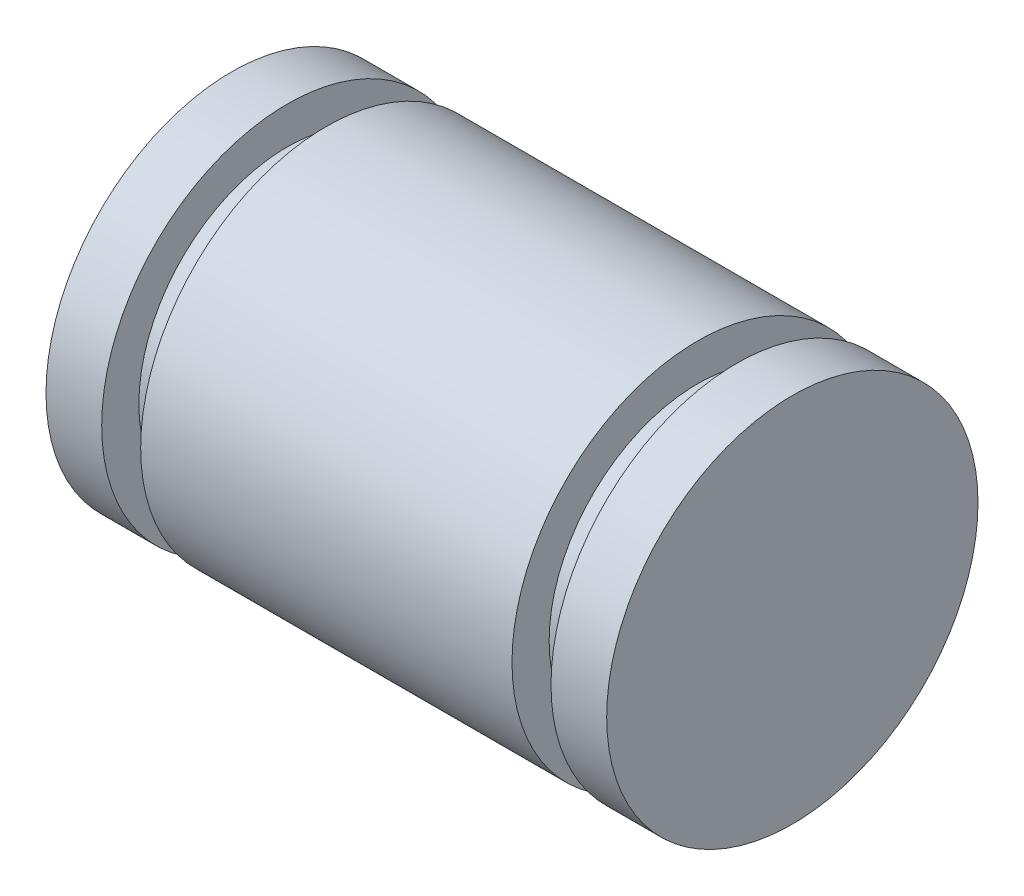
ISO-10303-21;
HEADER;
FILE_DESCRIPTION(('STEP AP214'),'2;1');
FILE_NAME('part.step','',(''),(''),'','','');
FILE_SCHEMA(('AUTOMOTIVE_DESIGN { 1 0 10303 214 1 1 1 1 }'));
ENDSEC;
DATA;
#1=APPLICATION_CONTEXT('core data for automotive mechanical design processes');
#2=APPLICATION_PROTOCOL_DEFINITION('international standard','automotive_design',2000,#1);
#3=PRODUCT_CONTEXT('',#1,'mechanical');
#4=PRODUCT('Part','Part','',(#3));
#5=PRODUCT_RELATED_PRODUCT_CATEGORY('part','',(#4));
#6=PRODUCT_DEFINITION_FORMATION('','',#4);
#7=PRODUCT_DEFINITION_CONTEXT('part definition',#1,'design');
#8=PRODUCT_DEFINITION('design','',#6,#7);
#9=PRODUCT_DEFINITION_SHAPE('','',#8);
#10=(LENGTH_UNIT() NAMED_UNIT(*) SI_UNIT(.MILLI.,.METRE.));
#11=(NAMED_UNIT(*) PLANE_ANGLE_UNIT() SI_UNIT($,.RADIAN.));
#12=(NAMED_UNIT(*) SI_UNIT($,.STERADIAN.) SOLID_ANGLE_UNIT());
#13=UNCERTAINTY_MEASURE_WITH_UNIT(LENGTH_MEASURE(1.E-05),#10,'distance_accuracy_value','');
#14=(GEOMETRIC_REPRESENTATION_CONTEXT(3) GLOBAL_UNCERTAINTY_ASSIGNED_CONTEXT((#13)) GLOBAL_UNIT_ASSIGNED_CONTEXT((#10,
#11,#12)) REPRESENTATION_CONTEXT('',''));
#15=CARTESIAN_POINT('',(0.,0.,0.));
#16=DIRECTION('',(0.,0.,1.));
#17=DIRECTION('',(1.,0.,0.));
#18=AXIS2_PLACEMENT_3D('',#15,#16,#17);
#19=CARTESIAN_POINT('',(15.1,0.,0.));
#20=DIRECTION('',(1.,0.,0.));
#21=DIRECTION('',(0.,0.,-1.));
#22=AXIS2_PLACEMENT_3D('',#19,#20,#21);
#23=PLANE('',#22);
#24=CARTESIAN_POINT('',(15.1,0.,0.));
#25=DIRECTION('',(-1.,0.,0.));
#26=DIRECTION('',(0.,0.,1.));
#27=AXIS2_PLACEMENT_3D('',#24,#25,#26);
#28=CIRCLE('',#27,5.);
#29=CARTESIAN_POINT('',(15.1,0.,5.));
#30=VERTEX_POINT('',#29);
#31=EDGE_CURVE('E10',#30,#30,#28,.T.);
#32=ORIENTED_EDGE('',*,*,#31,.F.);
#33=EDGE_LOOP('',(#32));
#34=FACE_BOUND('',#33,.T.);
#35=ADVANCED_FACE('F37',(#34),#23,.T.);
#36=CARTESIAN_POINT('',(0.,0.,0.));
#37=DIRECTION('',(-1.,0.,0.));
#38=DIRECTION('',(0.,0.,1.));
#39=AXIS2_PLACEMENT_3D('',#36,#37,#38);
#40=CYLINDRICAL_SURFACE('',#39,5.);
#41=ORIENTED_EDGE('',*,*,#31,.T.);
#42=EDGE_LOOP('',(#41));
#43=FACE_BOUND('',#42,.T.);
#44=CARTESIAN_POINT('',(13.6,0.,0.));
#45=DIRECTION('',(-1.,0.,0.));
#46=DIRECTION('',(0.,0.,1.));
#47=AXIS2_PLACEMENT_3D('',#44,#45,#46);
#48=CIRCLE('',#47,5.);
#49=CARTESIAN_POINT('',(13.6,0.,5.));
#50=VERTEX_POINT('',#49);
#51=EDGE_CURVE('E44',#50,#50,#48,.T.);
#52=ORIENTED_EDGE('',*,*,#51,.F.);
#53=EDGE_LOOP('',(#52));
#54=FACE_BOUND('',#53,.T.);
#55=ADVANCED_FACE('F101',(#43,#54),#40,.T.);
#56=CARTESIAN_POINT('',(13.6,-4.,0.));
#57=DIRECTION('',(-1.,0.,0.));
#58=DIRECTION('',(0.,0.,1.));
#59=AXIS2_PLACEMENT_3D('',#56,#57,#58);
#60=PLANE('',#59);
#61=ORIENTED_EDGE('',*,*,#51,.T.);
#62=EDGE_LOOP('',(#61));
#63=FACE_BOUND('',#62,.T.);
#64=CARTESIAN_POINT('',(13.6,0.,0.));
#65=DIRECTION('',(-1.,0.,0.));
#66=DIRECTION('',(0.,0.,1.));
#67=AXIS2_PLACEMENT_3D('',#64,#65,#66);
#68=CIRCLE('',#67,4.);
#69=CARTESIAN_POINT('',(13.6,0.,4.));
#70=VERTEX_POINT('',#69);
#71=EDGE_CURVE('E49',#70,#70,#68,.T.);
#72=ORIENTED_EDGE('',*,*,#71,.F.);
#73=EDGE_LOOP('',(#72));
#74=FACE_BOUND('',#73,.T.);
#75=ADVANCED_FACE('F106',(#63,#74),#60,.T.);
#76=CARTESIAN_POINT('',(0.,0.,0.));
#77=DIRECTION('',(-1.,0.,0.));
#78=DIRECTION('',(0.,0.,1.));
#79=AXIS2_PLACEMENT_3D('',#76,#77,#78);
#80=CYLINDRICAL_SURFACE('',#79,4.);
#81=ORIENTED_EDGE('',*,*,#71,.T.);
#82=EDGE_LOOP('',(#81));
#83=FACE_BOUND('',#82,.T.);
#84=CARTESIAN_POINT('',(12.55,0.,0.));
#85=DIRECTION('',(-1.,0.,0.));
#86=DIRECTION('',(0.,0.,1.));
#87=AXIS2_PLACEMENT_3D('',#84,#85,#86);
#88=CIRCLE('',#87,4.);
#89=CARTESIAN_POINT('',(12.55,0.,4.));
#90=VERTEX_POINT('',#89);
#91=EDGE_CURVE('E54',#90,#90,#88,.T.);
#92=ORIENTED_EDGE('',*,*,#91,.F.);
#93=EDGE_LOOP('',(#92));
#94=FACE_BOUND('',#93,.T.);
#95=ADVANCED_FACE('F110',(#83,#94),#80,.T.);
#96=CARTESIAN_POINT('',(12.55,-4.,0.));
#97=DIRECTION('',(1.,0.,0.));
#98=DIRECTION('',(0.,0.,-1.));
#99=AXIS2_PLACEMENT_3D('',#96,#97,#98);
#100=PLANE('',#99);
#101=ORIENTED_EDGE('',*,*,#91,.T.);
#102=EDGE_LOOP('',(#101));
#103=FACE_BOUND('',#102,.T.);
#104=CARTESIAN_POINT('',(12.55,0.,0.));
#105=DIRECTION('',(-1.,0.,0.));
#106=DIRECTION('',(0.,0.,1.));
#107=AXIS2_PLACEMENT_3D('',#104,#105,#106);
#108=CIRCLE('',#107,5.);
#109=CARTESIAN_POINT('',(12.55,0.,5.));
#110=VERTEX_POINT('',#109);
#111=EDGE_CURVE('E60',#110,#110,#108,.T.);
#112=ORIENTED_EDGE('',*,*,#111,.F.);
#113=EDGE_LOOP('',(#112));
#114=FACE_BOUND('',#113,.T.);
#115=ADVANCED_FACE('F116',(#103,#114),#100,.T.);
#116=CARTESIAN_POINT('',(0.,0.,0.));
#117=DIRECTION('',(-1.,0.,0.));
#118=DIRECTION('',(0.,0.,1.));
#119=AXIS2_PLACEMENT_3D('',#116,#117,#118);
#120=CYLINDRICAL_SURFACE('',#119,5.);
#121=ORIENTED_EDGE('',*,*,#111,.T.);
#122=EDGE_LOOP('',(#121));
#123=FACE_BOUND('',#122,.T.);
#124=CARTESIAN_POINT('',(2.55,0.,0.));
#125=DIRECTION('',(-1.,0.,0.));
#126=DIRECTION('',(0.,0.,1.));
#127=AXIS2_PLACEMENT_3D('',#124,#125,#126);
#128=CIRCLE('',#127,5.);
#129=CARTESIAN_POINT('',(2.55,0.,5.));
#130=VERTEX_POINT('',#129);
#131=EDGE_CURVE('E64',#130,#130,#128,.T.);
#132=ORIENTED_EDGE('',*,*,#131,.F.);
#133=EDGE_LOOP('',(#132));
#134=FACE_BOUND('',#133,.T.);
#135=ADVANCED_FACE('F120',(#123,#134),#120,.T.);
#136=CARTESIAN_POINT('',(2.55,-4.,0.));
#137=DIRECTION('',(-1.,0.,0.));
#138=DIRECTION('',(0.,0.,1.));
#139=AXIS2_PLACEMENT_3D('',#136,#137,#138);
#140=PLANE('',#139);
#141=ORIENTED_EDGE('',*,*,#131,.T.);
#142=EDGE_LOOP('',(#141));
#143=FACE_BOUND('',#142,.T.);
#144=CARTESIAN_POINT('',(2.55,0.,0.));
#145=DIRECTION('',(-1.,0.,0.));
#146=DIRECTION('',(0.,0.,1.));
#147=AXIS2_PLACEMENT_3D('',#144,#145,#146);
#148=CIRCLE('',#147,4.);
#149=CARTESIAN_POINT('',(2.55,0.,4.));
#150=VERTEX_POINT('',#149);
#151=EDGE_CURVE('E68',#150,#150,#148,.T.);
#152=ORIENTED_EDGE('',*,*,#151,.F.);
#153=EDGE_LOOP('',(#152));
#154=FACE_BOUND('',#153,.T.);
#155=ADVANCED_FACE('F124',(#143,#154),#140,.T.);
#156=CARTESIAN_POINT('',(0.,0.,0.));
#157=DIRECTION('',(-1.,0.,0.));
#158=DIRECTION('',(0.,0.,1.));
#159=AXIS2_PLACEMENT_3D('',#156,#157,#158);
#160=CYLINDRICAL_SURFACE('',#159,4.);
#161=ORIENTED_EDGE('',*,*,#151,.T.);
#162=EDGE_LOOP('',(#161));
#163=FACE_BOUND('',#162,.T.);
#164=CARTESIAN_POINT('',(1.5,0.,0.));
#165=DIRECTION('',(-1.,0.,0.));
#166=DIRECTION('',(0.,0.,1.));
#167=AXIS2_PLACEMENT_3D('',#164,#165,#166);
#168=CIRCLE('',#167,4.);
#169=CARTESIAN_POINT('',(1.5,0.,4.));
#170=VERTEX_POINT('',#169);
#171=EDGE_CURVE('E72',#170,#170,#168,.T.);
#172=ORIENTED_EDGE('',*,*,#171,.F.);
#173=EDGE_LOOP('',(#172));
#174=FACE_BOUND('',#173,.T.);
#175=ADVANCED_FACE('F97',(#163,#174),#160,.T.);
#176=CARTESIAN_POINT('',(1.5,-4.,0.));
#177=DIRECTION('',(1.,0.,0.));
#178=DIRECTION('',(0.,0.,-1.));
#179=AXIS2_PLACEMENT_3D('',#176,#177,#178);
#180=PLANE('',#179);
#181=ORIENTED_EDGE('',*,*,#171,.T.);
#182=EDGE_LOOP('',(#181));
#183=FACE_BOUND('',#182,.T.);
#184=CARTESIAN_POINT('',(1.5,0.,0.));
#185=DIRECTION('',(-1.,0.,0.));
#186=DIRECTION('',(0.,0.,1.));
#187=AXIS2_PLACEMENT_3D('',#184,#185,#186);
#188=CIRCLE('',#187,5.);
#189=CARTESIAN_POINT('',(1.5,0.,5.));
#190=VERTEX_POINT('',#189);
#191=EDGE_CURVE('E76',#190,#190,#188,.T.);
#192=ORIENTED_EDGE('',*,*,#191,.F.);
#193=EDGE_LOOP('',(#192));
#194=FACE_BOUND('',#193,.T.);
#195=ADVANCED_FACE('F89',(#183,#194),#180,.T.);
#196=CARTESIAN_POINT('',(0.,0.,0.));
#197=DIRECTION('',(-1.,0.,0.));
#198=DIRECTION('',(0.,0.,1.));
#199=AXIS2_PLACEMENT_3D('',#196,#197,#198);
#200=CYLINDRICAL_SURFACE('',#199,5.);
#201=ORIENTED_EDGE('',*,*,#191,.T.);
#202=EDGE_LOOP('',(#201));
#203=FACE_BOUND('',#202,.T.);
#204=CARTESIAN_POINT('',(0.,0.,0.));
#205=DIRECTION('',(-1.,0.,0.));
#206=DIRECTION('',(0.,0.,1.));
#207=AXIS2_PLACEMENT_3D('',#204,#205,#206);
#208=CIRCLE('',#207,5.);
#209=CARTESIAN_POINT('',(0.,0.,5.));
#210=VERTEX_POINT('',#209);
#211=EDGE_CURVE('E80',#210,#210,#208,.T.);
#212=ORIENTED_EDGE('',*,*,#211,.F.);
#213=EDGE_LOOP('',(#212));
#214=FACE_BOUND('',#213,.T.);
#215=ADVANCED_FACE('F87',(#203,#214),#200,.T.);
#216=CARTESIAN_POINT('',(0.,0.,0.));
#217=DIRECTION('',(-1.,0.,0.));
#218=DIRECTION('',(0.,0.,1.));
#219=AXIS2_PLACEMENT_3D('',#216,#217,#218);
#220=PLANE('',#219);
#221=ORIENTED_EDGE('',*,*,#211,.T.);
#222=EDGE_LOOP('',(#221));
#223=FACE_BOUND('',#222,.T.);
#224=ADVANCED_FACE('F85',(#223),#220,.T.);
#225=CLOSED_SHELL('',(#35,#55,#75,#95,#115,#135,#155,#175,#195,#215,#224));
#226=MANIFOLD_SOLID_BREP('B2',#225);
#227=ADVANCED_BREP_SHAPE_REPRESENTATION('',(#18,#226),#14);
#228=SHAPE_DEFINITION_REPRESENTATION(#9,#227);
ENDSEC;
END-ISO-10303-21;
